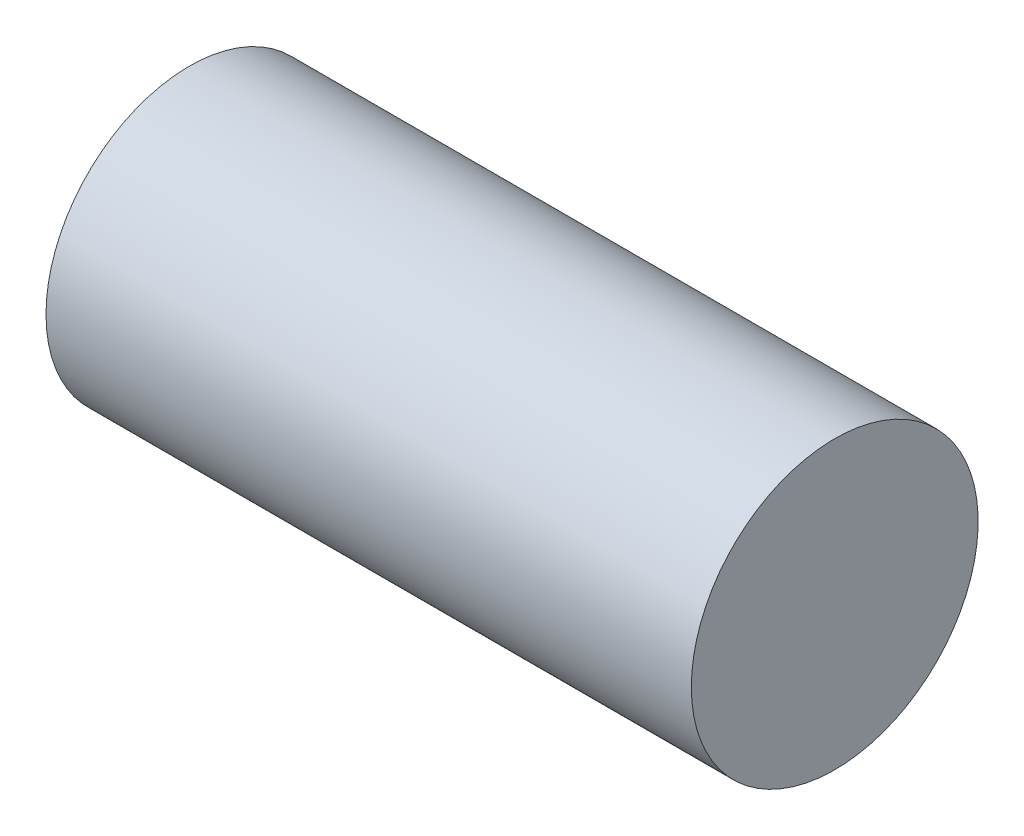
ISO-10303-21;
HEADER;
FILE_DESCRIPTION(('STEP AP214'),'2;1');
FILE_NAME('part.step','',(''),(''),'','','');
FILE_SCHEMA(('AUTOMOTIVE_DESIGN { 1 0 10303 214 1 1 1 1 }'));
ENDSEC;
DATA;
#1=APPLICATION_CONTEXT('core data for automotive mechanical design processes');
#2=APPLICATION_PROTOCOL_DEFINITION('international standard','automotive_design',2000,#1);
#3=PRODUCT_CONTEXT('',#1,'mechanical');
#4=PRODUCT('Part','Part','',(#3));
#5=PRODUCT_RELATED_PRODUCT_CATEGORY('part','',(#4));
#6=PRODUCT_DEFINITION_FORMATION('','',#4);
#7=PRODUCT_DEFINITION_CONTEXT('part definition',#1,'design');
#8=PRODUCT_DEFINITION('design','',#6,#7);
#9=PRODUCT_DEFINITION_SHAPE('','',#8);
#10=(LENGTH_UNIT() NAMED_UNIT(*) SI_UNIT(.MILLI.,.METRE.));
#11=(NAMED_UNIT(*) PLANE_ANGLE_UNIT() SI_UNIT($,.RADIAN.));
#12=(NAMED_UNIT(*) SI_UNIT($,.STERADIAN.) SOLID_ANGLE_UNIT());
#13=UNCERTAINTY_MEASURE_WITH_UNIT(LENGTH_MEASURE(1.E-05),#10,'distance_accuracy_value','');
#14=(GEOMETRIC_REPRESENTATION_CONTEXT(3) GLOBAL_UNCERTAINTY_ASSIGNED_CONTEXT((#13)) GLOBAL_UNIT_ASSIGNED_CONTEXT((#10,
#11,#12)) REPRESENTATION_CONTEXT('',''));
#15=CARTESIAN_POINT('',(0.,0.,0.));
#16=DIRECTION('',(0.,0.,1.));
#17=DIRECTION('',(1.,0.,0.));
#18=AXIS2_PLACEMENT_3D('',#15,#16,#17);
#19=CARTESIAN_POINT('',(0.,0.,0.));
#20=DIRECTION('',(1.,0.,0.));
#21=DIRECTION('',(0.,0.,-1.));
#22=AXIS2_PLACEMENT_3D('',#19,#20,#21);
#23=PLANE('',#22);
#24=CARTESIAN_POINT('',(0.,0.,0.));
#25=DIRECTION('',(1.,0.,0.));
#26=DIRECTION('',(0.,0.,-1.));
#27=AXIS2_PLACEMENT_3D('',#24,#25,#26);
#28=CIRCLE('',#27,4.7625);
#29=CARTESIAN_POINT('',(0.,0.,-4.7625));
#30=VERTEX_POINT('',#29);
#31=EDGE_CURVE('E45',#30,#30,#28,.F.);
#32=ORIENTED_EDGE('',*,*,#31,.F.);
#33=EDGE_LOOP('',(#32));
#34=FACE_BOUND('',#33,.T.);
#35=CARTESIAN_POINT('',(0.,0.,0.));
#36=DIRECTION('',(-1.,0.,0.));
#37=DIRECTION('',(0.,0.,1.));
#38=AXIS2_PLACEMENT_3D('',#35,#36,#37);
#39=CIRCLE('',#38,10.);
#40=CARTESIAN_POINT('',(0.,0.,10.));
#41=VERTEX_POINT('',#40);
#42=EDGE_CURVE('E10',#41,#41,#39,.T.);
#43=ORIENTED_EDGE('',*,*,#42,.T.);
#44=EDGE_LOOP('',(#43));
#45=FACE_BOUND('',#44,.T.);
#46=ADVANCED_FACE('F39',(#34,#45),#23,.F.);
#47=CARTESIAN_POINT('',(-1000.,0.,0.));
#48=DIRECTION('',(-1.,0.,0.));
#49=DIRECTION('',(0.,0.,1.));
#50=AXIS2_PLACEMENT_3D('',#47,#48,#49);
#51=CYLINDRICAL_SURFACE('',#50,10.);
#52=ORIENTED_EDGE('',*,*,#42,.F.);
#53=EDGE_LOOP('',(#52));
#54=FACE_BOUND('',#53,.T.);
#55=CARTESIAN_POINT('',(44.9999999999999,0.,0.));
#56=DIRECTION('',(-1.,0.,0.));
#57=DIRECTION('',(0.,0.,1.));
#58=AXIS2_PLACEMENT_3D('',#55,#56,#57);
#59=CIRCLE('',#58,10.);
#60=CARTESIAN_POINT('',(44.9999999999999,0.,10.));
#61=VERTEX_POINT('',#60);
#62=EDGE_CURVE('E46',#61,#61,#59,.T.);
#63=ORIENTED_EDGE('',*,*,#62,.T.);
#64=EDGE_LOOP('',(#63));
#65=FACE_BOUND('',#64,.T.);
#66=ADVANCED_FACE('F61',(#54,#65),#51,.T.);
#67=CARTESIAN_POINT('',(45.,10.,0.));
#68=DIRECTION('',(-1.,0.,0.));
#69=DIRECTION('',(0.,0.,1.));
#70=AXIS2_PLACEMENT_3D('',#67,#68,#69);
#71=PLANE('',#70);
#72=ORIENTED_EDGE('',*,*,#62,.F.);
#73=EDGE_LOOP('',(#72));
#74=FACE_BOUND('',#73,.T.);
#75=ADVANCED_FACE('F70',(#74),#71,.F.);
#76=CARTESIAN_POINT('',(-1000.,0.,0.));
#77=DIRECTION('',(-1.,0.,0.));
#78=DIRECTION('',(0.,0.,1.));
#79=AXIS2_PLACEMENT_3D('',#76,#77,#78);
#80=CYLINDRICAL_SURFACE('',#79,4.7625);
#81=CARTESIAN_POINT('',(16.7999999999999,0.,0.));
#82=DIRECTION('',(-1.,0.,0.));
#83=DIRECTION('',(0.,0.,1.));
#84=AXIS2_PLACEMENT_3D('',#81,#82,#83);
#85=CIRCLE('',#84,4.7625);
#86=CARTESIAN_POINT('',(16.7999999999999,0.,4.7625));
#87=VERTEX_POINT('',#86);
#88=EDGE_CURVE('E55',#87,#87,#85,.T.);
#89=ORIENTED_EDGE('',*,*,#88,.F.);
#90=EDGE_LOOP('',(#89));
#91=FACE_BOUND('',#90,.T.);
#92=ORIENTED_EDGE('',*,*,#31,.T.);
#93=EDGE_LOOP('',(#92));
#94=FACE_BOUND('',#93,.T.);
#95=ADVANCED_FACE('F56',(#91,#94),#80,.F.);
#96=CARTESIAN_POINT('',(16.8,4.7625,0.));
#97=DIRECTION('',(-1.,0.,0.));
#98=DIRECTION('',(0.,0.,1.));
#99=AXIS2_PLACEMENT_3D('',#96,#97,#98);
#100=PLANE('',#99);
#101=ORIENTED_EDGE('',*,*,#88,.T.);
#102=EDGE_LOOP('',(#101));
#103=FACE_BOUND('',#102,.T.);
#104=ADVANCED_FACE('F76',(#103),#100,.T.);
#105=CLOSED_SHELL('',(#46,#66,#75,#95,#104));
#106=MANIFOLD_SOLID_BREP('B2',#105);
#107=ADVANCED_BREP_SHAPE_REPRESENTATION('',(#18,#106),#14);
#108=SHAPE_DEFINITION_REPRESENTATION(#9,#107);
ENDSEC;
END-ISO-10303-21;
